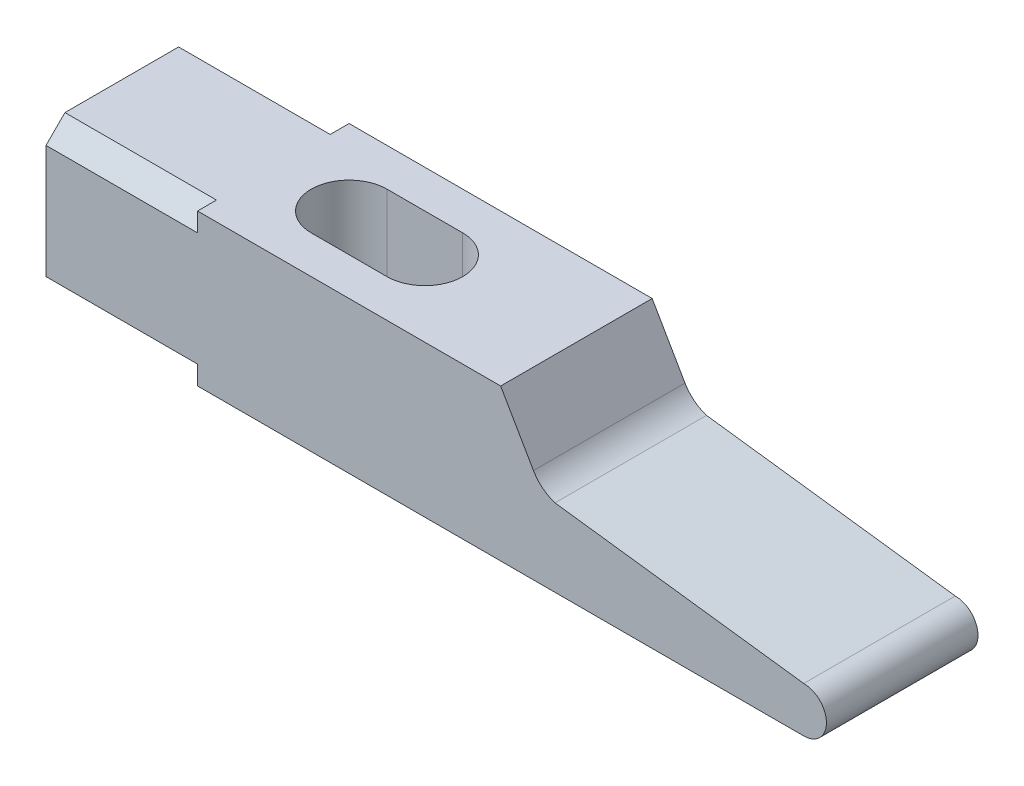
ISO-10303-21;
HEADER;
FILE_DESCRIPTION(('STEP AP214'),'2;1');
FILE_NAME('part.step','',(''),(''),'','','');
FILE_SCHEMA(('AUTOMOTIVE_DESIGN { 1 0 10303 214 1 1 1 1 }'));
ENDSEC;
DATA;
#1=APPLICATION_CONTEXT('core data for automotive mechanical design processes');
#2=APPLICATION_PROTOCOL_DEFINITION('international standard','automotive_design',2000,#1);
#3=PRODUCT_CONTEXT('',#1,'mechanical');
#4=PRODUCT('Part','Part','',(#3));
#5=PRODUCT_RELATED_PRODUCT_CATEGORY('part','',(#4));
#6=PRODUCT_DEFINITION_FORMATION('','',#4);
#7=PRODUCT_DEFINITION_CONTEXT('part definition',#1,'design');
#8=PRODUCT_DEFINITION('design','',#6,#7);
#9=PRODUCT_DEFINITION_SHAPE('','',#8);
#10=(LENGTH_UNIT() NAMED_UNIT(*) SI_UNIT(.MILLI.,.METRE.));
#11=(NAMED_UNIT(*) PLANE_ANGLE_UNIT() SI_UNIT($,.RADIAN.));
#12=(NAMED_UNIT(*) SI_UNIT($,.STERADIAN.) SOLID_ANGLE_UNIT());
#13=UNCERTAINTY_MEASURE_WITH_UNIT(LENGTH_MEASURE(1.E-05),#10,'distance_accuracy_value','');
#14=(GEOMETRIC_REPRESENTATION_CONTEXT(3) GLOBAL_UNCERTAINTY_ASSIGNED_CONTEXT((#13)) GLOBAL_UNIT_ASSIGNED_CONTEXT((#10,
#11,#12)) REPRESENTATION_CONTEXT('',''));
#15=CARTESIAN_POINT('',(0.,0.,0.));
#16=DIRECTION('',(0.,0.,1.));
#17=DIRECTION('',(1.,0.,0.));
#18=AXIS2_PLACEMENT_3D('',#15,#16,#17);
#19=CARTESIAN_POINT('',(100.,0.,10.));
#20=DIRECTION('',(0.,1.,0.));
#21=DIRECTION('',(-1.,0.,0.));
#22=AXIS2_PLACEMENT_3D('',#19,#20,#21);
#23=PLANE('',#22);
#24=DIRECTION('',(-1.,0.,0.));
#25=VECTOR('',#24,1.);
#26=CARTESIAN_POINT('',(30.,0.,-5.));
#27=LINE('',#26,#25);
#28=CARTESIAN_POINT('',(40.,0.,-5.));
#29=VERTEX_POINT('',#28);
#30=CARTESIAN_POINT('',(30.,0.,-5.));
#31=VERTEX_POINT('',#30);
#32=EDGE_CURVE('E284',#29,#31,#27,.T.);
#33=ORIENTED_EDGE('',*,*,#32,.T.);
#34=CARTESIAN_POINT('',(30.,0.,0.));
#35=DIRECTION('',(0.,1.,0.));
#36=DIRECTION('',(0.,0.,1.));
#37=AXIS2_PLACEMENT_3D('',#34,#35,#36);
#38=CIRCLE('',#37,5.);
#39=CARTESIAN_POINT('',(30.,0.,5.));
#40=VERTEX_POINT('',#39);
#41=EDGE_CURVE('E274',#31,#40,#38,.T.);
#42=ORIENTED_EDGE('',*,*,#41,.T.);
#43=DIRECTION('',(1.,0.,0.));
#44=VECTOR('',#43,1.);
#45=CARTESIAN_POINT('',(30.,0.,5.));
#46=LINE('',#45,#44);
#47=CARTESIAN_POINT('',(40.,0.,5.));
#48=VERTEX_POINT('',#47);
#49=EDGE_CURVE('E277',#40,#48,#46,.T.);
#50=ORIENTED_EDGE('',*,*,#49,.T.);
#51=CARTESIAN_POINT('',(40.,0.,0.));
#52=DIRECTION('',(0.,1.,0.));
#53=DIRECTION('',(0.,0.,1.));
#54=AXIS2_PLACEMENT_3D('',#51,#52,#53);
#55=CIRCLE('',#54,5.);
#56=EDGE_CURVE('E281',#48,#29,#55,.T.);
#57=ORIENTED_EDGE('',*,*,#56,.T.);
#58=EDGE_LOOP('',(#33,#42,#50,#57));
#59=FACE_BOUND('',#58,.T.);
#60=DIRECTION('',(-1.,0.,0.));
#61=VECTOR('',#60,1.);
#62=CARTESIAN_POINT('',(20.,0.,-7.49999999999983));
#63=LINE('',#62,#61);
#64=CARTESIAN_POINT('',(20.,0.,-7.49999999999983));
#65=VERTEX_POINT('',#64);
#66=CARTESIAN_POINT('',(0.,0.,-7.49999999999983));
#67=VERTEX_POINT('',#66);
#68=EDGE_CURVE('E329',#65,#67,#63,.T.);
#69=ORIENTED_EDGE('',*,*,#68,.F.);
#70=DIRECTION('',(0.,0.,1.));
#71=VECTOR('',#70,1.);
#72=CARTESIAN_POINT('',(20.,0.,0.));
#73=LINE('',#72,#71);
#74=CARTESIAN_POINT('',(20.,0.,-10.));
#75=VERTEX_POINT('',#74);
#76=EDGE_CURVE('E314',#75,#65,#73,.T.);
#77=ORIENTED_EDGE('',*,*,#76,.F.);
#78=DIRECTION('',(1.,0.,0.));
#79=VECTOR('',#78,1.);
#80=CARTESIAN_POINT('',(100.,0.,-10.));
#81=LINE('',#80,#79);
#82=CARTESIAN_POINT('',(100.,0.,-10.));
#83=VERTEX_POINT('',#82);
#84=EDGE_CURVE('E197',#75,#83,#81,.T.);
#85=ORIENTED_EDGE('',*,*,#84,.T.);
#86=DIRECTION('',(0.,0.,-1.));
#87=VECTOR('',#86,1.);
#88=CARTESIAN_POINT('',(100.,0.,10.));
#89=LINE('',#88,#87);
#90=CARTESIAN_POINT('',(100.,0.,10.));
#91=VERTEX_POINT('',#90);
#92=EDGE_CURVE('E11',#91,#83,#89,.T.);
#93=ORIENTED_EDGE('',*,*,#92,.F.);
#94=DIRECTION('',(1.,0.,0.));
#95=VECTOR('',#94,1.);
#96=CARTESIAN_POINT('',(100.,0.,10.));
#97=LINE('',#96,#95);
#98=CARTESIAN_POINT('',(20.,0.,10.));
#99=VERTEX_POINT('',#98);
#100=EDGE_CURVE('E214',#99,#91,#97,.T.);
#101=ORIENTED_EDGE('',*,*,#100,.F.);
#102=DIRECTION('',(0.,0.,1.));
#103=VECTOR('',#102,1.);
#104=CARTESIAN_POINT('',(20.,0.,0.));
#105=LINE('',#104,#103);
#106=CARTESIAN_POINT('',(20.,0.,7.49999999999996));
#107=VERTEX_POINT('',#106);
#108=EDGE_CURVE('E57',#107,#99,#105,.T.);
#109=ORIENTED_EDGE('',*,*,#108,.F.);
#110=DIRECTION('',(-1.,0.,0.));
#111=VECTOR('',#110,1.);
#112=CARTESIAN_POINT('',(20.,0.,7.49999999999996));
#113=LINE('',#112,#111);
#114=CARTESIAN_POINT('',(0.,0.,7.49999999999996));
#115=VERTEX_POINT('',#114);
#116=EDGE_CURVE('E345',#107,#115,#113,.T.);
#117=ORIENTED_EDGE('',*,*,#116,.T.);
#118=DIRECTION('',(0.,0.,-1.));
#119=VECTOR('',#118,1.);
#120=CARTESIAN_POINT('',(0.,0.,10.));
#121=LINE('',#120,#119);
#122=EDGE_CURVE('E191',#115,#67,#121,.T.);
#123=ORIENTED_EDGE('',*,*,#122,.T.);
#124=EDGE_LOOP('',(#69,#77,#85,#93,#101,#109,#117,#123));
#125=FACE_BOUND('',#124,.T.);
#126=ADVANCED_FACE('F35',(#59,#125),#23,.F.);
#127=CARTESIAN_POINT('',(0.,20.,10.));
#128=DIRECTION('',(0.,-1.,0.));
#129=DIRECTION('',(0.,0.,-1.));
#130=AXIS2_PLACEMENT_3D('',#127,#128,#129);
#131=PLANE('',#130);
#132=DIRECTION('',(1.,0.,0.));
#133=VECTOR('',#132,1.);
#134=CARTESIAN_POINT('',(30.,20.,5.));
#135=LINE('',#134,#133);
#136=CARTESIAN_POINT('',(30.,20.,5.));
#137=VERTEX_POINT('',#136);
#138=CARTESIAN_POINT('',(40.,20.,5.));
#139=VERTEX_POINT('',#138);
#140=EDGE_CURVE('E289',#137,#139,#135,.T.);
#141=ORIENTED_EDGE('',*,*,#140,.F.);
#142=CARTESIAN_POINT('',(30.,20.,0.));
#143=DIRECTION('',(0.,1.,0.));
#144=DIRECTION('',(0.,0.,1.));
#145=AXIS2_PLACEMENT_3D('',#142,#143,#144);
#146=CIRCLE('',#145,5.);
#147=CARTESIAN_POINT('',(30.,20.,-5.));
#148=VERTEX_POINT('',#147);
#149=EDGE_CURVE('E272',#148,#137,#146,.T.);
#150=ORIENTED_EDGE('',*,*,#149,.F.);
#151=DIRECTION('',(-1.,0.,0.));
#152=VECTOR('',#151,1.);
#153=CARTESIAN_POINT('',(30.,20.,-5.));
#154=LINE('',#153,#152);
#155=CARTESIAN_POINT('',(40.,20.,-5.));
#156=VERTEX_POINT('',#155);
#157=EDGE_CURVE('E278',#156,#148,#154,.T.);
#158=ORIENTED_EDGE('',*,*,#157,.F.);
#159=CARTESIAN_POINT('',(40.,20.,0.));
#160=DIRECTION('',(0.,1.,0.));
#161=DIRECTION('',(0.,0.,1.));
#162=AXIS2_PLACEMENT_3D('',#159,#160,#161);
#163=CIRCLE('',#162,5.);
#164=EDGE_CURVE('E292',#139,#156,#163,.T.);
#165=ORIENTED_EDGE('',*,*,#164,.F.);
#166=EDGE_LOOP('',(#141,#150,#158,#165));
#167=FACE_BOUND('',#166,.T.);
#168=DIRECTION('',(-1.,0.,0.));
#169=VECTOR('',#168,1.);
#170=CARTESIAN_POINT('',(20.,20.,7.50000000000029));
#171=LINE('',#170,#169);
#172=CARTESIAN_POINT('',(20.,20.,7.50000000000029));
#173=VERTEX_POINT('',#172);
#174=CARTESIAN_POINT('',(0.,20.,7.50000000000029));
#175=VERTEX_POINT('',#174);
#176=EDGE_CURVE('E180',#173,#175,#171,.T.);
#177=ORIENTED_EDGE('',*,*,#176,.F.);
#178=DIRECTION('',(0.,0.,-1.));
#179=VECTOR('',#178,1.);
#180=CARTESIAN_POINT('',(20.,20.,0.));
#181=LINE('',#180,#179);
#182=CARTESIAN_POINT('',(20.,20.,10.));
#183=VERTEX_POINT('',#182);
#184=EDGE_CURVE('E168',#183,#173,#181,.T.);
#185=ORIENTED_EDGE('',*,*,#184,.F.);
#186=DIRECTION('',(-1.,0.,0.));
#187=VECTOR('',#186,1.);
#188=CARTESIAN_POINT('',(0.,20.,10.));
#189=LINE('',#188,#187);
#190=CARTESIAN_POINT('',(60.,20.,10.));
#191=VERTEX_POINT('',#190);
#192=EDGE_CURVE('E178',#191,#183,#189,.T.);
#193=ORIENTED_EDGE('',*,*,#192,.F.);
#194=DIRECTION('',(0.,0.,-1.));
#195=VECTOR('',#194,1.);
#196=CARTESIAN_POINT('',(60.,20.,10.));
#197=LINE('',#196,#195);
#198=CARTESIAN_POINT('',(60.,20.,-10.));
#199=VERTEX_POINT('',#198);
#200=EDGE_CURVE('E220',#191,#199,#197,.T.);
#201=ORIENTED_EDGE('',*,*,#200,.T.);
#202=DIRECTION('',(-1.,0.,0.));
#203=VECTOR('',#202,1.);
#204=CARTESIAN_POINT('',(0.,20.,-10.));
#205=LINE('',#204,#203);
#206=CARTESIAN_POINT('',(20.,20.,-10.));
#207=VERTEX_POINT('',#206);
#208=EDGE_CURVE('E208',#199,#207,#205,.T.);
#209=ORIENTED_EDGE('',*,*,#208,.T.);
#210=DIRECTION('',(0.,0.,-1.));
#211=VECTOR('',#210,1.);
#212=CARTESIAN_POINT('',(20.,20.,0.));
#213=LINE('',#212,#211);
#214=CARTESIAN_POINT('',(20.,20.,-7.50000000000004));
#215=VERTEX_POINT('',#214);
#216=EDGE_CURVE('E261',#215,#207,#213,.T.);
#217=ORIENTED_EDGE('',*,*,#216,.F.);
#218=DIRECTION('',(-1.,0.,0.));
#219=VECTOR('',#218,1.);
#220=CARTESIAN_POINT('',(20.,20.,-7.50000000000004));
#221=LINE('',#220,#219);
#222=CARTESIAN_POINT('',(0.,20.,-7.50000000000004));
#223=VERTEX_POINT('',#222);
#224=EDGE_CURVE('E260',#215,#223,#221,.T.);
#225=ORIENTED_EDGE('',*,*,#224,.T.);
#226=DIRECTION('',(0.,0.,-1.));
#227=VECTOR('',#226,1.);
#228=CARTESIAN_POINT('',(0.,20.,10.));
#229=LINE('',#228,#227);
#230=EDGE_CURVE('E217',#175,#223,#229,.T.);
#231=ORIENTED_EDGE('',*,*,#230,.F.);
#232=EDGE_LOOP('',(#177,#185,#193,#201,#209,#217,#225,#231));
#233=FACE_BOUND('',#232,.T.);
#234=ADVANCED_FACE('F176',(#167,#233),#131,.F.);
#235=CARTESIAN_POINT('',(0.,0.,10.));
#236=DIRECTION('',(1.,0.,0.));
#237=DIRECTION('',(0.,0.,-1.));
#238=AXIS2_PLACEMENT_3D('',#235,#236,#237);
#239=PLANE('',#238);
#240=DIRECTION('',(0.,-0.707106781186548,0.707106781186547));
#241=VECTOR('',#240,1.);
#242=CARTESIAN_POINT('',(0.,-3.74999999999991,-3.74999999999992));
#243=LINE('',#242,#241);
#244=CARTESIAN_POINT('',(0.,2.50000000000018,-10.));
#245=VERTEX_POINT('',#244);
#246=EDGE_CURVE('E323',#245,#67,#243,.T.);
#247=ORIENTED_EDGE('',*,*,#246,.T.);
#248=ORIENTED_EDGE('',*,*,#122,.F.);
#249=DIRECTION('',(0.,0.707106781186554,0.707106781186541));
#250=VECTOR('',#249,1.);
#251=CARTESIAN_POINT('',(0.,-3.74999999999998,3.75000000000005));
#252=LINE('',#251,#250);
#253=CARTESIAN_POINT('',(0.,2.50000000000009,10.));
#254=VERTEX_POINT('',#253);
#255=EDGE_CURVE('E331',#115,#254,#252,.T.);
#256=ORIENTED_EDGE('',*,*,#255,.T.);
#257=DIRECTION('',(0.,-1.,0.));
#258=VECTOR('',#257,1.);
#259=CARTESIAN_POINT('',(0.,0.,10.));
#260=LINE('',#259,#258);
#261=CARTESIAN_POINT('',(0.,17.5000000000003,10.));
#262=VERTEX_POINT('',#261);
#263=EDGE_CURVE('E188',#262,#254,#260,.T.);
#264=ORIENTED_EDGE('',*,*,#263,.F.);
#265=DIRECTION('',(0.,0.707106781186544,-0.707106781186551));
#266=VECTOR('',#265,1.);
#267=CARTESIAN_POINT('',(0.,13.7500000000003,13.7500000000001));
#268=LINE('',#267,#266);
#269=EDGE_CURVE('E339',#262,#175,#268,.T.);
#270=ORIENTED_EDGE('',*,*,#269,.T.);
#271=ORIENTED_EDGE('',*,*,#230,.T.);
#272=DIRECTION('',(0.,-0.707106781186554,-0.707106781186541));
#273=VECTOR('',#272,1.);
#274=CARTESIAN_POINT('',(0.,13.7499999999998,-13.7500000000001));
#275=LINE('',#274,#273);
#276=CARTESIAN_POINT('',(0.,17.5,-10.));
#277=VERTEX_POINT('',#276);
#278=EDGE_CURVE('E269',#223,#277,#275,.T.);
#279=ORIENTED_EDGE('',*,*,#278,.T.);
#280=DIRECTION('',(0.,-1.,0.));
#281=VECTOR('',#280,1.);
#282=CARTESIAN_POINT('',(0.,0.,-10.));
#283=LINE('',#282,#281);
#284=EDGE_CURVE('E211',#277,#245,#283,.T.);
#285=ORIENTED_EDGE('',*,*,#284,.T.);
#286=EDGE_LOOP('',(#247,#248,#256,#264,#270,#271,#279,#285));
#287=FACE_BOUND('',#286,.T.);
#288=ADVANCED_FACE('F337',(#287),#239,.F.);
#289=CARTESIAN_POINT('',(68.6602540378444,15.,10.));
#290=DIRECTION('',(0.,0.,-1.));
#291=DIRECTION('',(-1.,0.,0.));
#292=AXIS2_PLACEMENT_3D('',#289,#290,#291);
#293=PLANE('',#292);
#294=DIRECTION('',(-1.,0.,0.));
#295=VECTOR('',#294,1.);
#296=CARTESIAN_POINT('',(20.,2.50000000000009,10.));
#297=LINE('',#296,#295);
#298=CARTESIAN_POINT('',(20.,2.50000000000009,10.));
#299=VERTEX_POINT('',#298);
#300=EDGE_CURVE('E342',#299,#254,#297,.T.);
#301=ORIENTED_EDGE('',*,*,#300,.F.);
#302=DIRECTION('',(0.,1.,0.));
#303=VECTOR('',#302,1.);
#304=CARTESIAN_POINT('',(20.,0.,10.));
#305=LINE('',#304,#303);
#306=EDGE_CURVE('E353',#99,#299,#305,.T.);
#307=ORIENTED_EDGE('',*,*,#306,.F.);
#308=ORIENTED_EDGE('',*,*,#100,.T.);
#309=CARTESIAN_POINT('',(100.,3.,10.));
#310=DIRECTION('',(0.,0.,1.));
#311=DIRECTION('',(-1.,0.,0.));
#312=AXIS2_PLACEMENT_3D('',#309,#310,#311);
#313=CIRCLE('',#312,3.);
#314=CARTESIAN_POINT('',(100.,6.,10.));
#315=VERTEX_POINT('',#314);
#316=EDGE_CURVE('E305',#91,#315,#313,.T.);
#317=ORIENTED_EDGE('',*,*,#316,.T.);
#318=DIRECTION('',(-0.991814073618998,0.127690420045083,0.));
#319=VECTOR('',#318,1.);
#320=CARTESIAN_POINT('',(67.1731354466047,10.2262720756636,10.));
#321=LINE('',#320,#319);
#322=CARTESIAN_POINT('',(67.1731354466047,10.2262720756636,10.));
#323=VERTEX_POINT('',#322);
#324=EDGE_CURVE('E234',#315,#323,#321,.T.);
#325=ORIENTED_EDGE('',*,*,#324,.T.);
#326=CARTESIAN_POINT('',(68.6602540378444,15.,10.));
#327=DIRECTION('',(0.,0.,-1.));
#328=DIRECTION('',(-1.,0.,0.));
#329=AXIS2_PLACEMENT_3D('',#326,#327,#328);
#330=CIRCLE('',#329,5.);
#331=CARTESIAN_POINT('',(64.3301270189222,12.5,10.));
#332=VERTEX_POINT('',#331);
#333=EDGE_CURVE('E193',#323,#332,#330,.T.);
#334=ORIENTED_EDGE('',*,*,#333,.T.);
#335=DIRECTION('',(-0.499999999999998,0.86602540378444,0.));
#336=VECTOR('',#335,1.);
#337=CARTESIAN_POINT('',(60.,20.,10.));
#338=LINE('',#337,#336);
#339=EDGE_CURVE('E186',#332,#191,#338,.T.);
#340=ORIENTED_EDGE('',*,*,#339,.T.);
#341=ORIENTED_EDGE('',*,*,#192,.T.);
#342=DIRECTION('',(0.,1.,0.));
#343=VECTOR('',#342,1.);
#344=CARTESIAN_POINT('',(20.,0.,10.));
#345=LINE('',#344,#343);
#346=CARTESIAN_POINT('',(20.,17.5000000000003,10.));
#347=VERTEX_POINT('',#346);
#348=EDGE_CURVE('E165',#347,#183,#345,.T.);
#349=ORIENTED_EDGE('',*,*,#348,.F.);
#350=DIRECTION('',(-1.,0.,0.));
#351=VECTOR('',#350,1.);
#352=CARTESIAN_POINT('',(20.,17.5000000000003,10.));
#353=LINE('',#352,#351);
#354=EDGE_CURVE('E181',#347,#262,#353,.T.);
#355=ORIENTED_EDGE('',*,*,#354,.T.);
#356=ORIENTED_EDGE('',*,*,#263,.T.);
#357=EDGE_LOOP('',(#301,#307,#308,#317,#325,#334,#340,#341,#349,#355,#356));
#358=FACE_BOUND('',#357,.T.);
#359=ADVANCED_FACE('F184',(#358),#293,.F.);
#360=CARTESIAN_POINT('',(68.6602540378444,15.,-10.));
#361=DIRECTION('',(0.,0.,-1.));
#362=DIRECTION('',(-1.,0.,0.));
#363=AXIS2_PLACEMENT_3D('',#360,#361,#362);
#364=PLANE('',#363);
#365=DIRECTION('',(0.,-1.,0.));
#366=VECTOR('',#365,1.);
#367=CARTESIAN_POINT('',(20.,0.,-10.));
#368=LINE('',#367,#366);
#369=CARTESIAN_POINT('',(20.,2.50000000000018,-10.));
#370=VERTEX_POINT('',#369);
#371=EDGE_CURVE('E316',#370,#75,#368,.T.);
#372=ORIENTED_EDGE('',*,*,#371,.F.);
#373=DIRECTION('',(-1.,0.,0.));
#374=VECTOR('',#373,1.);
#375=CARTESIAN_POINT('',(20.,2.50000000000018,-10.));
#376=LINE('',#375,#374);
#377=EDGE_CURVE('E318',#370,#245,#376,.T.);
#378=ORIENTED_EDGE('',*,*,#377,.T.);
#379=ORIENTED_EDGE('',*,*,#284,.F.);
#380=DIRECTION('',(-1.,0.,0.));
#381=VECTOR('',#380,1.);
#382=CARTESIAN_POINT('',(20.,17.5,-10.));
#383=LINE('',#382,#381);
#384=CARTESIAN_POINT('',(20.,17.5,-10.));
#385=VERTEX_POINT('',#384);
#386=EDGE_CURVE('E257',#385,#277,#383,.T.);
#387=ORIENTED_EDGE('',*,*,#386,.F.);
#388=DIRECTION('',(0.,-1.,0.));
#389=VECTOR('',#388,1.);
#390=CARTESIAN_POINT('',(20.,0.,-10.));
#391=LINE('',#390,#389);
#392=EDGE_CURVE('E255',#207,#385,#391,.T.);
#393=ORIENTED_EDGE('',*,*,#392,.F.);
#394=ORIENTED_EDGE('',*,*,#208,.F.);
#395=DIRECTION('',(-0.499999999999998,0.86602540378444,0.));
#396=VECTOR('',#395,1.);
#397=CARTESIAN_POINT('',(60.,20.,-10.));
#398=LINE('',#397,#396);
#399=CARTESIAN_POINT('',(64.3301270189222,12.5,-10.));
#400=VERTEX_POINT('',#399);
#401=EDGE_CURVE('E206',#400,#199,#398,.T.);
#402=ORIENTED_EDGE('',*,*,#401,.F.);
#403=CARTESIAN_POINT('',(68.6602540378444,15.,-10.));
#404=DIRECTION('',(0.,0.,-1.));
#405=DIRECTION('',(-1.,0.,0.));
#406=AXIS2_PLACEMENT_3D('',#403,#404,#405);
#407=CIRCLE('',#406,5.);
#408=CARTESIAN_POINT('',(67.1731354466047,10.2262720756636,-10.));
#409=VERTEX_POINT('',#408);
#410=EDGE_CURVE('E204',#409,#400,#407,.T.);
#411=ORIENTED_EDGE('',*,*,#410,.F.);
#412=DIRECTION('',(-0.991814073618998,0.127690420045083,0.));
#413=VECTOR('',#412,1.);
#414=CARTESIAN_POINT('',(67.1731354466047,10.2262720756636,-10.));
#415=LINE('',#414,#413);
#416=CARTESIAN_POINT('',(100.,6.,-10.));
#417=VERTEX_POINT('',#416);
#418=EDGE_CURVE('E202',#417,#409,#415,.T.);
#419=ORIENTED_EDGE('',*,*,#418,.F.);
#420=CARTESIAN_POINT('',(100.,3.,-10.));
#421=DIRECTION('',(0.,0.,1.));
#422=DIRECTION('',(-1.,0.,0.));
#423=AXIS2_PLACEMENT_3D('',#420,#421,#422);
#424=CIRCLE('',#423,3.);
#425=EDGE_CURVE('E199',#83,#417,#424,.T.);
#426=ORIENTED_EDGE('',*,*,#425,.F.);
#427=ORIENTED_EDGE('',*,*,#84,.F.);
#428=EDGE_LOOP('',(#372,#378,#379,#387,#393,#394,#402,#411,#419,#426,#427));
#429=FACE_BOUND('',#428,.T.);
#430=ADVANCED_FACE('F241',(#429),#364,.T.);
#431=CARTESIAN_POINT('',(100.,3.,10.));
#432=DIRECTION('',(0.,0.,-1.));
#433=DIRECTION('',(-1.,0.,0.));
#434=AXIS2_PLACEMENT_3D('',#431,#432,#433);
#435=CYLINDRICAL_SURFACE('',#434,3.);
#436=ORIENTED_EDGE('',*,*,#425,.T.);
#437=DIRECTION('',(0.,0.,-1.));
#438=VECTOR('',#437,1.);
#439=CARTESIAN_POINT('',(100.,6.,10.));
#440=LINE('',#439,#438);
#441=EDGE_CURVE('E42',#315,#417,#440,.T.);
#442=ORIENTED_EDGE('',*,*,#441,.F.);
#443=ORIENTED_EDGE('',*,*,#316,.F.);
#444=ORIENTED_EDGE('',*,*,#92,.T.);
#445=EDGE_LOOP('',(#436,#442,#443,#444));
#446=FACE_BOUND('',#445,.T.);
#447=ADVANCED_FACE('F309',(#446),#435,.T.);
#448=CARTESIAN_POINT('',(67.1731354466047,10.2262720756636,10.));
#449=DIRECTION('',(-0.127690420045083,-0.991814073618998,0.));
#450=DIRECTION('',(0.991814073618998,-0.127690420045083,0.));
#451=AXIS2_PLACEMENT_3D('',#448,#449,#450);
#452=PLANE('',#451);
#453=ORIENTED_EDGE('',*,*,#418,.T.);
#454=DIRECTION('',(0.,0.,-1.));
#455=VECTOR('',#454,1.);
#456=CARTESIAN_POINT('',(67.1731354466047,10.2262720756636,10.));
#457=LINE('',#456,#455);
#458=EDGE_CURVE('E225',#323,#409,#457,.T.);
#459=ORIENTED_EDGE('',*,*,#458,.F.);
#460=ORIENTED_EDGE('',*,*,#324,.F.);
#461=ORIENTED_EDGE('',*,*,#441,.T.);
#462=EDGE_LOOP('',(#453,#459,#460,#461));
#463=FACE_BOUND('',#462,.T.);
#464=ADVANCED_FACE('F232',(#463),#452,.F.);
#465=CARTESIAN_POINT('',(68.6602540378444,15.,10.));
#466=DIRECTION('',(0.,0.,-1.));
#467=DIRECTION('',(-1.,0.,0.));
#468=AXIS2_PLACEMENT_3D('',#465,#466,#467);
#469=CYLINDRICAL_SURFACE('',#468,5.);
#470=ORIENTED_EDGE('',*,*,#410,.T.);
#471=DIRECTION('',(0.,0.,-1.));
#472=VECTOR('',#471,1.);
#473=CARTESIAN_POINT('',(64.3301270189222,12.5,10.));
#474=LINE('',#473,#472);
#475=EDGE_CURVE('E222',#332,#400,#474,.T.);
#476=ORIENTED_EDGE('',*,*,#475,.F.);
#477=ORIENTED_EDGE('',*,*,#333,.F.);
#478=ORIENTED_EDGE('',*,*,#458,.T.);
#479=EDGE_LOOP('',(#470,#476,#477,#478));
#480=FACE_BOUND('',#479,.T.);
#481=ADVANCED_FACE('F247',(#480),#469,.F.);
#482=CARTESIAN_POINT('',(60.,20.,10.));
#483=DIRECTION('',(-0.86602540378444,-0.499999999999998,0.));
#484=DIRECTION('',(0.499999999999998,-0.86602540378444,0.));
#485=AXIS2_PLACEMENT_3D('',#482,#483,#484);
#486=PLANE('',#485);
#487=ORIENTED_EDGE('',*,*,#401,.T.);
#488=ORIENTED_EDGE('',*,*,#200,.F.);
#489=ORIENTED_EDGE('',*,*,#339,.F.);
#490=ORIENTED_EDGE('',*,*,#475,.T.);
#491=EDGE_LOOP('',(#487,#488,#489,#490));
#492=FACE_BOUND('',#491,.T.);
#493=ADVANCED_FACE('F250',(#492),#486,.F.);
#494=CARTESIAN_POINT('',(30.,0.,0.));
#495=DIRECTION('',(0.,1.,0.));
#496=DIRECTION('',(0.,0.,1.));
#497=AXIS2_PLACEMENT_3D('',#494,#495,#496);
#498=CYLINDRICAL_SURFACE('',#497,5.);
#499=ORIENTED_EDGE('',*,*,#149,.T.);
#500=DIRECTION('',(0.,1.,0.));
#501=VECTOR('',#500,1.);
#502=CARTESIAN_POINT('',(30.,0.,5.));
#503=LINE('',#502,#501);
#504=EDGE_CURVE('E287',#40,#137,#503,.T.);
#505=ORIENTED_EDGE('',*,*,#504,.F.);
#506=ORIENTED_EDGE('',*,*,#41,.F.);
#507=DIRECTION('',(0.,1.,0.));
#508=VECTOR('',#507,1.);
#509=CARTESIAN_POINT('',(30.,0.,-5.));
#510=LINE('',#509,#508);
#511=EDGE_CURVE('E200',#31,#148,#510,.T.);
#512=ORIENTED_EDGE('',*,*,#511,.T.);
#513=EDGE_LOOP('',(#499,#505,#506,#512));
#514=FACE_BOUND('',#513,.T.);
#515=ADVANCED_FACE('F385',(#514),#498,.F.);
#516=CARTESIAN_POINT('',(30.,0.,-5.));
#517=DIRECTION('',(0.,0.,-1.));
#518=DIRECTION('',(-1.,0.,0.));
#519=AXIS2_PLACEMENT_3D('',#516,#517,#518);
#520=PLANE('',#519);
#521=ORIENTED_EDGE('',*,*,#157,.T.);
#522=ORIENTED_EDGE('',*,*,#511,.F.);
#523=ORIENTED_EDGE('',*,*,#32,.F.);
#524=DIRECTION('',(0.,1.,0.));
#525=VECTOR('',#524,1.);
#526=CARTESIAN_POINT('',(40.,0.,-5.));
#527=LINE('',#526,#525);
#528=EDGE_CURVE('E298',#29,#156,#527,.T.);
#529=ORIENTED_EDGE('',*,*,#528,.T.);
#530=EDGE_LOOP('',(#521,#522,#523,#529));
#531=FACE_BOUND('',#530,.T.);
#532=ADVANCED_FACE('F381',(#531),#520,.F.);
#533=CARTESIAN_POINT('',(40.,0.,0.));
#534=DIRECTION('',(0.,1.,0.));
#535=DIRECTION('',(0.,0.,1.));
#536=AXIS2_PLACEMENT_3D('',#533,#534,#535);
#537=CYLINDRICAL_SURFACE('',#536,5.);
#538=ORIENTED_EDGE('',*,*,#164,.T.);
#539=ORIENTED_EDGE('',*,*,#528,.F.);
#540=ORIENTED_EDGE('',*,*,#56,.F.);
#541=DIRECTION('',(0.,1.,0.));
#542=VECTOR('',#541,1.);
#543=CARTESIAN_POINT('',(40.,0.,5.));
#544=LINE('',#543,#542);
#545=EDGE_CURVE('E300',#48,#139,#544,.T.);
#546=ORIENTED_EDGE('',*,*,#545,.T.);
#547=EDGE_LOOP('',(#538,#539,#540,#546));
#548=FACE_BOUND('',#547,.T.);
#549=ADVANCED_FACE('F393',(#548),#537,.F.);
#550=CARTESIAN_POINT('',(30.,0.,5.));
#551=DIRECTION('',(0.,0.,1.));
#552=DIRECTION('',(1.,0.,0.));
#553=AXIS2_PLACEMENT_3D('',#550,#551,#552);
#554=PLANE('',#553);
#555=ORIENTED_EDGE('',*,*,#140,.T.);
#556=ORIENTED_EDGE('',*,*,#545,.F.);
#557=ORIENTED_EDGE('',*,*,#49,.F.);
#558=ORIENTED_EDGE('',*,*,#504,.T.);
#559=EDGE_LOOP('',(#555,#556,#557,#558));
#560=FACE_BOUND('',#559,.T.);
#561=ADVANCED_FACE('F390',(#560),#554,.F.);
#562=CARTESIAN_POINT('',(20.,13.7499999999998,-13.7500000000001));
#563=DIRECTION('',(0.,0.707106781186541,-0.707106781186554));
#564=DIRECTION('',(0.,0.707106781186554,0.707106781186541));
#565=AXIS2_PLACEMENT_3D('',#562,#563,#564);
#566=PLANE('',#565);
#567=ORIENTED_EDGE('',*,*,#278,.F.);
#568=ORIENTED_EDGE('',*,*,#224,.F.);
#569=DIRECTION('',(0.,-0.707106781186554,-0.707106781186541));
#570=VECTOR('',#569,1.);
#571=CARTESIAN_POINT('',(20.,13.7499999999998,-13.7500000000001));
#572=LINE('',#571,#570);
#573=EDGE_CURVE('E265',#215,#385,#572,.T.);
#574=ORIENTED_EDGE('',*,*,#573,.T.);
#575=ORIENTED_EDGE('',*,*,#386,.T.);
#576=EDGE_LOOP('',(#567,#568,#574,#575));
#577=FACE_BOUND('',#576,.T.);
#578=ADVANCED_FACE('F333',(#577),#566,.T.);
#579=CARTESIAN_POINT('',(20.,0.,0.));
#580=DIRECTION('',(-1.,0.,0.));
#581=DIRECTION('',(0.,0.,1.));
#582=AXIS2_PLACEMENT_3D('',#579,#580,#581);
#583=PLANE('',#582);
#584=ORIENTED_EDGE('',*,*,#573,.F.);
#585=ORIENTED_EDGE('',*,*,#216,.T.);
#586=ORIENTED_EDGE('',*,*,#392,.T.);
#587=EDGE_LOOP('',(#584,#585,#586));
#588=FACE_BOUND('',#587,.T.);
#589=ADVANCED_FACE('F334',(#588),#583,.T.);
#590=CARTESIAN_POINT('',(20.,-3.74999999999991,-3.74999999999992));
#591=DIRECTION('',(0.,-0.707106781186547,-0.707106781186548));
#592=DIRECTION('',(0.,0.707106781186548,-0.707106781186547));
#593=AXIS2_PLACEMENT_3D('',#590,#591,#592);
#594=PLANE('',#593);
#595=ORIENTED_EDGE('',*,*,#246,.F.);
#596=ORIENTED_EDGE('',*,*,#377,.F.);
#597=DIRECTION('',(0.,-0.707106781186548,0.707106781186547));
#598=VECTOR('',#597,1.);
#599=CARTESIAN_POINT('',(20.,-3.74999999999991,-3.74999999999992));
#600=LINE('',#599,#598);
#601=EDGE_CURVE('E320',#370,#65,#600,.T.);
#602=ORIENTED_EDGE('',*,*,#601,.T.);
#603=ORIENTED_EDGE('',*,*,#68,.T.);
#604=EDGE_LOOP('',(#595,#596,#602,#603));
#605=FACE_BOUND('',#604,.T.);
#606=ADVANCED_FACE('F359',(#605),#594,.T.);
#607=CARTESIAN_POINT('',(20.,0.,0.));
#608=DIRECTION('',(-1.,0.,0.));
#609=DIRECTION('',(0.,0.,1.));
#610=AXIS2_PLACEMENT_3D('',#607,#608,#609);
#611=PLANE('',#610);
#612=ORIENTED_EDGE('',*,*,#601,.F.);
#613=ORIENTED_EDGE('',*,*,#371,.T.);
#614=ORIENTED_EDGE('',*,*,#76,.T.);
#615=EDGE_LOOP('',(#612,#613,#614));
#616=FACE_BOUND('',#615,.T.);
#617=ADVANCED_FACE('F360',(#616),#611,.T.);
#618=CARTESIAN_POINT('',(20.,13.7500000000003,13.7500000000001));
#619=DIRECTION('',(0.,0.707106781186551,0.707106781186544));
#620=DIRECTION('',(0.,-0.707106781186544,0.707106781186551));
#621=AXIS2_PLACEMENT_3D('',#618,#619,#620);
#622=PLANE('',#621);
#623=ORIENTED_EDGE('',*,*,#269,.F.);
#624=ORIENTED_EDGE('',*,*,#354,.F.);
#625=DIRECTION('',(0.,0.707106781186544,-0.707106781186551));
#626=VECTOR('',#625,1.);
#627=CARTESIAN_POINT('',(20.,13.7500000000003,13.7500000000001));
#628=LINE('',#627,#626);
#629=EDGE_CURVE('E49',#347,#173,#628,.T.);
#630=ORIENTED_EDGE('',*,*,#629,.T.);
#631=ORIENTED_EDGE('',*,*,#176,.T.);
#632=EDGE_LOOP('',(#623,#624,#630,#631));
#633=FACE_BOUND('',#632,.T.);
#634=ADVANCED_FACE('F362',(#633),#622,.T.);
#635=CARTESIAN_POINT('',(20.,0.,0.));
#636=DIRECTION('',(-1.,0.,0.));
#637=DIRECTION('',(0.,0.,1.));
#638=AXIS2_PLACEMENT_3D('',#635,#636,#637);
#639=PLANE('',#638);
#640=ORIENTED_EDGE('',*,*,#629,.F.);
#641=ORIENTED_EDGE('',*,*,#348,.T.);
#642=ORIENTED_EDGE('',*,*,#184,.T.);
#643=EDGE_LOOP('',(#640,#641,#642));
#644=FACE_BOUND('',#643,.T.);
#645=ADVANCED_FACE('F167',(#644),#639,.T.);
#646=CARTESIAN_POINT('',(20.,-3.74999999999998,3.75000000000005));
#647=DIRECTION('',(0.,-0.707106781186541,0.707106781186554));
#648=DIRECTION('',(0.,-0.707106781186554,-0.707106781186541));
#649=AXIS2_PLACEMENT_3D('',#646,#647,#648);
#650=PLANE('',#649);
#651=ORIENTED_EDGE('',*,*,#255,.F.);
#652=ORIENTED_EDGE('',*,*,#116,.F.);
#653=DIRECTION('',(0.,0.707106781186554,0.707106781186541));
#654=VECTOR('',#653,1.);
#655=CARTESIAN_POINT('',(20.,-3.74999999999998,3.75000000000005));
#656=LINE('',#655,#654);
#657=EDGE_CURVE('E350',#107,#299,#656,.T.);
#658=ORIENTED_EDGE('',*,*,#657,.T.);
#659=ORIENTED_EDGE('',*,*,#300,.T.);
#660=EDGE_LOOP('',(#651,#652,#658,#659));
#661=FACE_BOUND('',#660,.T.);
#662=ADVANCED_FACE('F518',(#661),#650,.T.);
#663=CARTESIAN_POINT('',(20.,0.,0.));
#664=DIRECTION('',(-1.,0.,0.));
#665=DIRECTION('',(0.,0.,1.));
#666=AXIS2_PLACEMENT_3D('',#663,#664,#665);
#667=PLANE('',#666);
#668=ORIENTED_EDGE('',*,*,#657,.F.);
#669=ORIENTED_EDGE('',*,*,#108,.T.);
#670=ORIENTED_EDGE('',*,*,#306,.T.);
#671=EDGE_LOOP('',(#668,#669,#670));
#672=FACE_BOUND('',#671,.T.);
#673=ADVANCED_FACE('F527',(#672),#667,.T.);
#674=CLOSED_SHELL('',(#126,#234,#288,#359,#430,#447,#464,#481,#493,#515,#532,#549,#561,#578,
#589,#606,#617,#634,#645,#662,#673));
#675=MANIFOLD_SOLID_BREP('B2',#674);
#676=ADVANCED_BREP_SHAPE_REPRESENTATION('',(#18,#675),#14);
#677=SHAPE_DEFINITION_REPRESENTATION(#9,#676);
ENDSEC;
END-ISO-10303-21;
